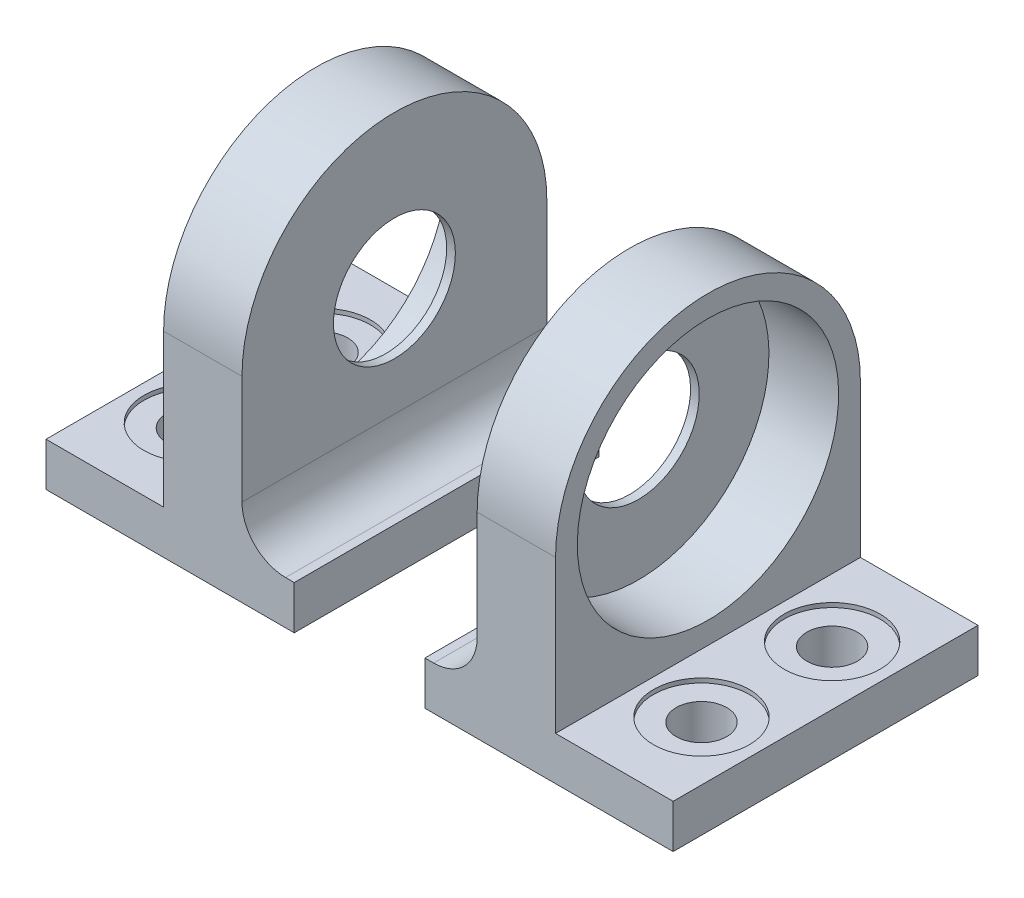
ISO-10303-21;
HEADER;
FILE_DESCRIPTION(('STEP AP214'),'2;1');
FILE_NAME('part.step','',(''),(''),'','','');
FILE_SCHEMA(('AUTOMOTIVE_DESIGN { 1 0 10303 214 1 1 1 1 }'));
ENDSEC;
DATA;
#1=APPLICATION_CONTEXT('core data for automotive mechanical design processes');
#2=APPLICATION_PROTOCOL_DEFINITION('international standard','automotive_design',2000,#1);
#3=PRODUCT_CONTEXT('',#1,'mechanical');
#4=PRODUCT('Part','Part','',(#3));
#5=PRODUCT_RELATED_PRODUCT_CATEGORY('part','',(#4));
#6=PRODUCT_DEFINITION_FORMATION('','',#4);
#7=PRODUCT_DEFINITION_CONTEXT('part definition',#1,'design');
#8=PRODUCT_DEFINITION('design','',#6,#7);
#9=PRODUCT_DEFINITION_SHAPE('','',#8);
#10=(LENGTH_UNIT() NAMED_UNIT(*) SI_UNIT(.MILLI.,.METRE.));
#11=(NAMED_UNIT(*) PLANE_ANGLE_UNIT() SI_UNIT($,.RADIAN.));
#12=(NAMED_UNIT(*) SI_UNIT($,.STERADIAN.) SOLID_ANGLE_UNIT());
#13=UNCERTAINTY_MEASURE_WITH_UNIT(LENGTH_MEASURE(1.E-05),#10,'distance_accuracy_value','');
#14=(GEOMETRIC_REPRESENTATION_CONTEXT(3) GLOBAL_UNCERTAINTY_ASSIGNED_CONTEXT((#13)) GLOBAL_UNIT_ASSIGNED_CONTEXT((#10,
#11,#12)) REPRESENTATION_CONTEXT('',''));
#15=CARTESIAN_POINT('',(0.,0.,0.));
#16=DIRECTION('',(0.,0.,1.));
#17=DIRECTION('',(1.,0.,0.));
#18=AXIS2_PLACEMENT_3D('',#15,#16,#17);
#19=CARTESIAN_POINT('',(36.,5.,35.));
#20=DIRECTION('',(-1.,0.,0.));
#21=DIRECTION('',(0.,-1.,0.));
#22=AXIS2_PLACEMENT_3D('',#19,#20,#21);
#23=PLANE('',#22);
#24=CARTESIAN_POINT('',(36.,22.5,17.5));
#25=DIRECTION('',(1.,0.,0.));
#26=DIRECTION('',(0.,1.,0.));
#27=AXIS2_PLACEMENT_3D('',#24,#25,#26);
#28=CIRCLE('',#27,15.);
#29=CARTESIAN_POINT('',(36.,37.5,17.5));
#30=VERTEX_POINT('',#29);
#31=EDGE_CURVE('E206',#30,#30,#28,.T.);
#32=ORIENTED_EDGE('',*,*,#31,.F.);
#33=EDGE_LOOP('',(#32));
#34=FACE_BOUND('',#33,.T.);
#35=DIRECTION('',(0.,1.,0.));
#36=VECTOR('',#35,1.);
#37=CARTESIAN_POINT('',(36.,5.,0.));
#38=LINE('',#37,#36);
#39=CARTESIAN_POINT('',(36.,5.,0.));
#40=VERTEX_POINT('',#39);
#41=CARTESIAN_POINT('',(36.,22.5,0.));
#42=VERTEX_POINT('',#41);
#43=EDGE_CURVE('E136',#40,#42,#38,.T.);
#44=ORIENTED_EDGE('',*,*,#43,.T.);
#45=CARTESIAN_POINT('',(36.,22.5,17.5));
#46=DIRECTION('',(1.,0.,0.));
#47=DIRECTION('',(0.,1.,0.));
#48=AXIS2_PLACEMENT_3D('',#45,#46,#47);
#49=CIRCLE('',#48,17.5);
#50=CARTESIAN_POINT('',(36.,22.5,35.));
#51=VERTEX_POINT('',#50);
#52=EDGE_CURVE('E124',#42,#51,#49,.T.);
#53=ORIENTED_EDGE('',*,*,#52,.T.);
#54=DIRECTION('',(0.,1.,0.));
#55=VECTOR('',#54,1.);
#56=CARTESIAN_POINT('',(36.,5.,35.));
#57=LINE('',#56,#55);
#58=CARTESIAN_POINT('',(36.,5.,35.));
#59=VERTEX_POINT('',#58);
#60=EDGE_CURVE('E193',#59,#51,#57,.T.);
#61=ORIENTED_EDGE('',*,*,#60,.F.);
#62=DIRECTION('',(0.,0.,-1.));
#63=VECTOR('',#62,1.);
#64=CARTESIAN_POINT('',(36.,5.,35.));
#65=LINE('',#64,#63);
#66=EDGE_CURVE('E147',#59,#40,#65,.T.);
#67=ORIENTED_EDGE('',*,*,#66,.T.);
#68=EDGE_LOOP('',(#44,#53,#61,#67));
#69=FACE_BOUND('',#68,.T.);
#70=ADVANCED_FACE('F48',(#34,#69),#23,.F.);
#71=CARTESIAN_POINT('',(27.,5.,35.));
#72=DIRECTION('',(1.,0.,0.));
#73=DIRECTION('',(0.,1.,0.));
#74=AXIS2_PLACEMENT_3D('',#71,#72,#73);
#75=PLANE('',#74);
#76=CARTESIAN_POINT('',(27.,22.5,17.5));
#77=DIRECTION('',(-1.,0.,0.));
#78=DIRECTION('',(0.,-1.,0.));
#79=AXIS2_PLACEMENT_3D('',#76,#77,#78);
#80=CIRCLE('',#79,7.);
#81=CARTESIAN_POINT('',(27.,15.5,17.5));
#82=VERTEX_POINT('',#81);
#83=EDGE_CURVE('E212',#82,#82,#80,.T.);
#84=ORIENTED_EDGE('',*,*,#83,.F.);
#85=EDGE_LOOP('',(#84));
#86=FACE_BOUND('',#85,.T.);
#87=DIRECTION('',(0.,-1.,0.));
#88=VECTOR('',#87,1.);
#89=CARTESIAN_POINT('',(27.,5.,0.));
#90=LINE('',#89,#88);
#91=CARTESIAN_POINT('',(27.,22.5,0.));
#92=VERTEX_POINT('',#91);
#93=CARTESIAN_POINT('',(27.,9.99999999999999,0.));
#94=VERTEX_POINT('',#93);
#95=EDGE_CURVE('E119',#92,#94,#90,.T.);
#96=ORIENTED_EDGE('',*,*,#95,.T.);
#97=DIRECTION('',(0.,0.,-1.));
#98=VECTOR('',#97,1.);
#99=CARTESIAN_POINT('',(27.,9.99999999999999,35.));
#100=LINE('',#99,#98);
#101=CARTESIAN_POINT('',(27.,9.99999999999999,35.));
#102=VERTEX_POINT('',#101);
#103=EDGE_CURVE('E63',#94,#102,#100,.F.);
#104=ORIENTED_EDGE('',*,*,#103,.T.);
#105=DIRECTION('',(0.,-1.,0.));
#106=VECTOR('',#105,1.);
#107=CARTESIAN_POINT('',(27.,5.,35.));
#108=LINE('',#107,#106);
#109=CARTESIAN_POINT('',(27.,22.5,35.));
#110=VERTEX_POINT('',#109);
#111=EDGE_CURVE('E120',#110,#102,#108,.T.);
#112=ORIENTED_EDGE('',*,*,#111,.F.);
#113=CARTESIAN_POINT('',(27.,22.5,17.5));
#114=DIRECTION('',(1.,0.,0.));
#115=DIRECTION('',(0.,1.,0.));
#116=AXIS2_PLACEMENT_3D('',#113,#114,#115);
#117=CIRCLE('',#116,17.5);
#118=EDGE_CURVE('E116',#92,#110,#117,.T.);
#119=ORIENTED_EDGE('',*,*,#118,.F.);
#120=EDGE_LOOP('',(#96,#104,#112,#119));
#121=FACE_BOUND('',#120,.T.);
#122=ADVANCED_FACE('F118',(#86,#121),#75,.F.);
#123=CARTESIAN_POINT('',(21.,0.,35.));
#124=DIRECTION('',(1.,0.,0.));
#125=DIRECTION('',(0.,0.,-1.));
#126=AXIS2_PLACEMENT_3D('',#123,#124,#125);
#127=PLANE('',#126);
#128=DIRECTION('',(0.,-1.,0.));
#129=VECTOR('',#128,1.);
#130=CARTESIAN_POINT('',(21.,0.,0.));
#131=LINE('',#130,#129);
#132=CARTESIAN_POINT('',(21.,4.99999999999999,0.));
#133=VERTEX_POINT('',#132);
#134=CARTESIAN_POINT('',(21.,0.,0.));
#135=VERTEX_POINT('',#134);
#136=EDGE_CURVE('E172',#133,#135,#131,.T.);
#137=ORIENTED_EDGE('',*,*,#136,.T.);
#138=DIRECTION('',(0.,0.,-1.));
#139=VECTOR('',#138,1.);
#140=CARTESIAN_POINT('',(21.,0.,35.));
#141=LINE('',#140,#139);
#142=CARTESIAN_POINT('',(21.,0.,35.));
#143=VERTEX_POINT('',#142);
#144=EDGE_CURVE('E157',#143,#135,#141,.T.);
#145=ORIENTED_EDGE('',*,*,#144,.F.);
#146=DIRECTION('',(0.,-1.,0.));
#147=VECTOR('',#146,1.);
#148=CARTESIAN_POINT('',(21.,0.,35.));
#149=LINE('',#148,#147);
#150=CARTESIAN_POINT('',(21.,4.99999999999999,35.));
#151=VERTEX_POINT('',#150);
#152=EDGE_CURVE('E138',#151,#143,#149,.T.);
#153=ORIENTED_EDGE('',*,*,#152,.F.);
#154=DIRECTION('',(0.,0.,-1.));
#155=VECTOR('',#154,1.);
#156=CARTESIAN_POINT('',(21.,4.99999999999999,35.));
#157=LINE('',#156,#155);
#158=EDGE_CURVE('E144',#151,#133,#157,.T.);
#159=ORIENTED_EDGE('',*,*,#158,.T.);
#160=EDGE_LOOP('',(#137,#145,#153,#159));
#161=FACE_BOUND('',#160,.T.);
#162=ADVANCED_FACE('F274',(#161),#127,.F.);
#163=CARTESIAN_POINT('',(35.062518270898,0.,35.));
#164=DIRECTION('',(0.,1.,0.));
#165=DIRECTION('',(-1.,0.,0.));
#166=AXIS2_PLACEMENT_3D('',#163,#164,#165);
#167=PLANE('',#166);
#168=CARTESIAN_POINT('',(42.75,0.,10.));
#169=DIRECTION('',(0.,1.,0.));
#170=DIRECTION('',(0.,0.,1.));
#171=AXIS2_PLACEMENT_3D('',#168,#169,#170);
#172=CIRCLE('',#171,2.9);
#173=CARTESIAN_POINT('',(42.75,0.,12.9));
#174=VERTEX_POINT('',#173);
#175=EDGE_CURVE('E229',#174,#174,#172,.T.);
#176=ORIENTED_EDGE('',*,*,#175,.T.);
#177=EDGE_LOOP('',(#176));
#178=FACE_BOUND('',#177,.T.);
#179=CARTESIAN_POINT('',(42.75,0.,25.));
#180=DIRECTION('',(0.,1.,0.));
#181=DIRECTION('',(0.,0.,1.));
#182=AXIS2_PLACEMENT_3D('',#179,#180,#181);
#183=CIRCLE('',#182,2.9);
#184=CARTESIAN_POINT('',(42.75,0.,27.9));
#185=VERTEX_POINT('',#184);
#186=EDGE_CURVE('E215',#185,#185,#183,.T.);
#187=ORIENTED_EDGE('',*,*,#186,.T.);
#188=EDGE_LOOP('',(#187));
#189=FACE_BOUND('',#188,.T.);
#190=DIRECTION('',(1.,0.,0.));
#191=VECTOR('',#190,1.);
#192=CARTESIAN_POINT('',(35.062518270898,0.,0.));
#193=LINE('',#192,#191);
#194=CARTESIAN_POINT('',(49.5,0.,0.));
#195=VERTEX_POINT('',#194);
#196=EDGE_CURVE('E174',#135,#195,#193,.T.);
#197=ORIENTED_EDGE('',*,*,#196,.T.);
#198=DIRECTION('',(0.,0.,-1.));
#199=VECTOR('',#198,1.);
#200=CARTESIAN_POINT('',(49.5,0.,35.));
#201=LINE('',#200,#199);
#202=CARTESIAN_POINT('',(49.5,0.,35.));
#203=VERTEX_POINT('',#202);
#204=EDGE_CURVE('E154',#203,#195,#201,.T.);
#205=ORIENTED_EDGE('',*,*,#204,.F.);
#206=DIRECTION('',(1.,0.,0.));
#207=VECTOR('',#206,1.);
#208=CARTESIAN_POINT('',(27.,0.,35.));
#209=LINE('',#208,#207);
#210=EDGE_CURVE('E201',#143,#203,#209,.T.);
#211=ORIENTED_EDGE('',*,*,#210,.F.);
#212=ORIENTED_EDGE('',*,*,#144,.T.);
#213=EDGE_LOOP('',(#197,#205,#211,#212));
#214=FACE_BOUND('',#213,.T.);
#215=ADVANCED_FACE('F282',(#178,#189,#214),#167,.F.);
#216=CARTESIAN_POINT('',(49.5,0.,35.));
#217=DIRECTION('',(-1.,0.,0.));
#218=DIRECTION('',(0.,0.,1.));
#219=AXIS2_PLACEMENT_3D('',#216,#217,#218);
#220=PLANE('',#219);
#221=DIRECTION('',(0.,1.,0.));
#222=VECTOR('',#221,1.);
#223=CARTESIAN_POINT('',(49.5,0.,0.));
#224=LINE('',#223,#222);
#225=CARTESIAN_POINT('',(49.5,5.00000000000001,0.));
#226=VERTEX_POINT('',#225);
#227=EDGE_CURVE('E178',#195,#226,#224,.T.);
#228=ORIENTED_EDGE('',*,*,#227,.T.);
#229=DIRECTION('',(0.,0.,-1.));
#230=VECTOR('',#229,1.);
#231=CARTESIAN_POINT('',(49.5,5.00000000000001,35.));
#232=LINE('',#231,#230);
#233=CARTESIAN_POINT('',(49.5,5.00000000000001,35.));
#234=VERTEX_POINT('',#233);
#235=EDGE_CURVE('E151',#234,#226,#232,.T.);
#236=ORIENTED_EDGE('',*,*,#235,.F.);
#237=DIRECTION('',(0.,1.,0.));
#238=VECTOR('',#237,1.);
#239=CARTESIAN_POINT('',(49.5,0.,35.));
#240=LINE('',#239,#238);
#241=EDGE_CURVE('E197',#203,#234,#240,.T.);
#242=ORIENTED_EDGE('',*,*,#241,.F.);
#243=ORIENTED_EDGE('',*,*,#204,.T.);
#244=EDGE_LOOP('',(#228,#236,#242,#243));
#245=FACE_BOUND('',#244,.T.);
#246=ADVANCED_FACE('F246',(#245),#220,.F.);
#247=CARTESIAN_POINT('',(36.,5.,35.));
#248=DIRECTION('',(0.,-1.,0.));
#249=DIRECTION('',(1.,0.,0.));
#250=AXIS2_PLACEMENT_3D('',#247,#248,#249);
#251=PLANE('',#250);
#252=CARTESIAN_POINT('',(42.75,5.00000000000001,10.));
#253=DIRECTION('',(0.,1.,0.));
#254=DIRECTION('',(0.,0.,1.));
#255=AXIS2_PLACEMENT_3D('',#252,#253,#254);
#256=CIRCLE('',#255,5.49999999999999);
#257=CARTESIAN_POINT('',(42.75,5.00000000000001,15.5));
#258=VERTEX_POINT('',#257);
#259=EDGE_CURVE('E238',#258,#258,#256,.T.);
#260=ORIENTED_EDGE('',*,*,#259,.F.);
#261=EDGE_LOOP('',(#260));
#262=FACE_BOUND('',#261,.T.);
#263=CARTESIAN_POINT('',(42.75,5.00000000000001,25.));
#264=DIRECTION('',(0.,1.,0.));
#265=DIRECTION('',(0.,0.,1.));
#266=AXIS2_PLACEMENT_3D('',#263,#264,#265);
#267=CIRCLE('',#266,5.49999999999999);
#268=CARTESIAN_POINT('',(42.75,5.00000000000001,30.5));
#269=VERTEX_POINT('',#268);
#270=EDGE_CURVE('E226',#269,#269,#267,.T.);
#271=ORIENTED_EDGE('',*,*,#270,.F.);
#272=EDGE_LOOP('',(#271));
#273=FACE_BOUND('',#272,.T.);
#274=DIRECTION('',(-1.,0.,0.));
#275=VECTOR('',#274,1.);
#276=CARTESIAN_POINT('',(36.,5.,0.));
#277=LINE('',#276,#275);
#278=EDGE_CURVE('E140',#226,#40,#277,.T.);
#279=ORIENTED_EDGE('',*,*,#278,.T.);
#280=ORIENTED_EDGE('',*,*,#66,.F.);
#281=DIRECTION('',(-1.,0.,0.));
#282=VECTOR('',#281,1.);
#283=CARTESIAN_POINT('',(36.,5.,35.));
#284=LINE('',#283,#282);
#285=EDGE_CURVE('E195',#234,#59,#284,.T.);
#286=ORIENTED_EDGE('',*,*,#285,.F.);
#287=ORIENTED_EDGE('',*,*,#235,.T.);
#288=EDGE_LOOP('',(#279,#280,#286,#287));
#289=FACE_BOUND('',#288,.T.);
#290=ADVANCED_FACE('F187',(#262,#273,#289),#251,.F.);
#291=CARTESIAN_POINT('',(27.,5.,35.));
#292=DIRECTION('',(0.,-1.,0.));
#293=DIRECTION('',(1.,0.,0.));
#294=AXIS2_PLACEMENT_3D('',#291,#292,#293);
#295=PLANE('',#294);
#296=DIRECTION('',(-1.,0.,0.));
#297=VECTOR('',#296,1.);
#298=CARTESIAN_POINT('',(27.,5.,35.));
#299=LINE('',#298,#297);
#300=CARTESIAN_POINT('',(22.,4.99999999999999,35.));
#301=VERTEX_POINT('',#300);
#302=EDGE_CURVE('E148',#301,#151,#299,.T.);
#303=ORIENTED_EDGE('',*,*,#302,.F.);
#304=DIRECTION('',(0.,0.,-1.));
#305=VECTOR('',#304,1.);
#306=CARTESIAN_POINT('',(22.,4.99999999999999,0.));
#307=LINE('',#306,#305);
#308=CARTESIAN_POINT('',(22.,4.99999999999999,0.));
#309=VERTEX_POINT('',#308);
#310=EDGE_CURVE('E160',#301,#309,#307,.T.);
#311=ORIENTED_EDGE('',*,*,#310,.T.);
#312=DIRECTION('',(-1.,0.,0.));
#313=VECTOR('',#312,1.);
#314=CARTESIAN_POINT('',(27.,5.,0.));
#315=LINE('',#314,#313);
#316=EDGE_CURVE('E135',#309,#133,#315,.T.);
#317=ORIENTED_EDGE('',*,*,#316,.T.);
#318=ORIENTED_EDGE('',*,*,#158,.F.);
#319=EDGE_LOOP('',(#303,#311,#317,#318));
#320=FACE_BOUND('',#319,.T.);
#321=ADVANCED_FACE('F166',(#320),#295,.F.);
#322=CARTESIAN_POINT('',(0.,0.,35.));
#323=DIRECTION('',(0.,0.,1.));
#324=DIRECTION('',(1.,0.,0.));
#325=AXIS2_PLACEMENT_3D('',#322,#323,#324);
#326=PLANE('',#325);
#327=DIRECTION('',(1.,0.,0.));
#328=VECTOR('',#327,1.);
#329=CARTESIAN_POINT('',(27.,22.5,35.));
#330=LINE('',#329,#328);
#331=EDGE_CURVE('E123',#110,#51,#330,.T.);
#332=ORIENTED_EDGE('',*,*,#331,.F.);
#333=ORIENTED_EDGE('',*,*,#111,.T.);
#334=CARTESIAN_POINT('',(22.,9.99999999999999,35.));
#335=DIRECTION('',(0.,0.,1.));
#336=DIRECTION('',(1.,0.,0.));
#337=AXIS2_PLACEMENT_3D('',#334,#335,#336);
#338=CIRCLE('',#337,5.);
#339=EDGE_CURVE('E12',#102,#301,#338,.F.);
#340=ORIENTED_EDGE('',*,*,#339,.T.);
#341=ORIENTED_EDGE('',*,*,#302,.T.);
#342=ORIENTED_EDGE('',*,*,#152,.T.);
#343=ORIENTED_EDGE('',*,*,#210,.T.);
#344=ORIENTED_EDGE('',*,*,#241,.T.);
#345=ORIENTED_EDGE('',*,*,#285,.T.);
#346=ORIENTED_EDGE('',*,*,#60,.T.);
#347=EDGE_LOOP('',(#332,#333,#340,#341,#342,#343,#344,#345,#346));
#348=FACE_BOUND('',#347,.T.);
#349=ADVANCED_FACE('F318',(#348),#326,.T.);
#350=CARTESIAN_POINT('',(0.,0.,0.));
#351=DIRECTION('',(0.,0.,1.));
#352=DIRECTION('',(1.,0.,0.));
#353=AXIS2_PLACEMENT_3D('',#350,#351,#352);
#354=PLANE('',#353);
#355=ORIENTED_EDGE('',*,*,#95,.F.);
#356=DIRECTION('',(1.,0.,0.));
#357=VECTOR('',#356,1.);
#358=CARTESIAN_POINT('',(27.,22.5,0.));
#359=LINE('',#358,#357);
#360=EDGE_CURVE('E127',#92,#42,#359,.T.);
#361=ORIENTED_EDGE('',*,*,#360,.T.);
#362=ORIENTED_EDGE('',*,*,#43,.F.);
#363=ORIENTED_EDGE('',*,*,#278,.F.);
#364=ORIENTED_EDGE('',*,*,#227,.F.);
#365=ORIENTED_EDGE('',*,*,#196,.F.);
#366=ORIENTED_EDGE('',*,*,#136,.F.);
#367=ORIENTED_EDGE('',*,*,#316,.F.);
#368=CARTESIAN_POINT('',(22.,9.99999999999999,0.));
#369=DIRECTION('',(0.,0.,1.));
#370=DIRECTION('',(1.,0.,0.));
#371=AXIS2_PLACEMENT_3D('',#368,#369,#370);
#372=CIRCLE('',#371,5.);
#373=EDGE_CURVE('E56',#309,#94,#372,.T.);
#374=ORIENTED_EDGE('',*,*,#373,.T.);
#375=EDGE_LOOP('',(#355,#361,#362,#363,#364,#365,#366,#367,#374));
#376=FACE_BOUND('',#375,.T.);
#377=ADVANCED_FACE('F134',(#376),#354,.F.);
#378=CARTESIAN_POINT('',(27.,22.5,17.5));
#379=DIRECTION('',(1.,0.,0.));
#380=DIRECTION('',(0.,1.,0.));
#381=AXIS2_PLACEMENT_3D('',#378,#379,#380);
#382=CYLINDRICAL_SURFACE('',#381,17.5);
#383=ORIENTED_EDGE('',*,*,#52,.F.);
#384=ORIENTED_EDGE('',*,*,#360,.F.);
#385=ORIENTED_EDGE('',*,*,#118,.T.);
#386=ORIENTED_EDGE('',*,*,#331,.T.);
#387=EDGE_LOOP('',(#383,#384,#385,#386));
#388=FACE_BOUND('',#387,.T.);
#389=ADVANCED_FACE('F128',(#388),#382,.T.);
#390=CARTESIAN_POINT('',(28.,22.5,17.5));
#391=DIRECTION('',(1.,0.,0.));
#392=DIRECTION('',(0.,1.,0.));
#393=AXIS2_PLACEMENT_3D('',#390,#391,#392);
#394=CYLINDRICAL_SURFACE('',#393,15.);
#395=CARTESIAN_POINT('',(28.,22.5,17.5));
#396=DIRECTION('',(1.,0.,0.));
#397=DIRECTION('',(0.,1.,0.));
#398=AXIS2_PLACEMENT_3D('',#395,#396,#397);
#399=CIRCLE('',#398,15.);
#400=CARTESIAN_POINT('',(28.,37.5,17.5));
#401=VERTEX_POINT('',#400);
#402=EDGE_CURVE('E132',#401,#401,#399,.T.);
#403=ORIENTED_EDGE('',*,*,#402,.F.);
#404=EDGE_LOOP('',(#403));
#405=FACE_BOUND('',#404,.T.);
#406=ORIENTED_EDGE('',*,*,#31,.T.);
#407=EDGE_LOOP('',(#406));
#408=FACE_BOUND('',#407,.T.);
#409=ADVANCED_FACE('F341',(#405,#408),#394,.F.);
#410=CARTESIAN_POINT('',(28.,22.5,17.5));
#411=DIRECTION('',(1.,0.,0.));
#412=DIRECTION('',(0.,1.,0.));
#413=AXIS2_PLACEMENT_3D('',#410,#411,#412);
#414=PLANE('',#413);
#415=CARTESIAN_POINT('',(28.,22.5,17.5));
#416=DIRECTION('',(-1.,0.,0.));
#417=DIRECTION('',(0.,-1.,0.));
#418=AXIS2_PLACEMENT_3D('',#415,#416,#417);
#419=CIRCLE('',#418,7.);
#420=CARTESIAN_POINT('',(28.,15.5,17.5));
#421=VERTEX_POINT('',#420);
#422=EDGE_CURVE('E209',#421,#421,#419,.T.);
#423=ORIENTED_EDGE('',*,*,#422,.T.);
#424=EDGE_LOOP('',(#423));
#425=FACE_BOUND('',#424,.T.);
#426=ORIENTED_EDGE('',*,*,#402,.T.);
#427=EDGE_LOOP('',(#426));
#428=FACE_BOUND('',#427,.T.);
#429=ADVANCED_FACE('F348',(#425,#428),#414,.T.);
#430=CARTESIAN_POINT('',(28.,22.5,17.5));
#431=DIRECTION('',(-1.,0.,0.));
#432=DIRECTION('',(0.,-1.,0.));
#433=AXIS2_PLACEMENT_3D('',#430,#431,#432);
#434=CYLINDRICAL_SURFACE('',#433,7.);
#435=ORIENTED_EDGE('',*,*,#422,.F.);
#436=EDGE_LOOP('',(#435));
#437=FACE_BOUND('',#436,.T.);
#438=ORIENTED_EDGE('',*,*,#83,.T.);
#439=EDGE_LOOP('',(#438));
#440=FACE_BOUND('',#439,.T.);
#441=ADVANCED_FACE('F356',(#437,#440),#434,.F.);
#442=CARTESIAN_POINT('',(42.75,5.00000000000001,25.));
#443=DIRECTION('',(0.,1.,0.));
#444=DIRECTION('',(0.,0.,1.));
#445=AXIS2_PLACEMENT_3D('',#442,#443,#444);
#446=CYLINDRICAL_SURFACE('',#445,2.9);
#447=ORIENTED_EDGE('',*,*,#186,.F.);
#448=EDGE_LOOP('',(#447));
#449=FACE_BOUND('',#448,.T.);
#450=CARTESIAN_POINT('',(42.75,4.5,25.));
#451=DIRECTION('',(0.,1.,0.));
#452=DIRECTION('',(0.,0.,1.));
#453=AXIS2_PLACEMENT_3D('',#450,#451,#452);
#454=CIRCLE('',#453,2.9);
#455=CARTESIAN_POINT('',(42.75,4.5,27.9));
#456=VERTEX_POINT('',#455);
#457=EDGE_CURVE('E220',#456,#456,#454,.T.);
#458=ORIENTED_EDGE('',*,*,#457,.T.);
#459=EDGE_LOOP('',(#458));
#460=FACE_BOUND('',#459,.T.);
#461=ADVANCED_FACE('F263',(#449,#460),#446,.F.);
#462=CARTESIAN_POINT('',(45.65,4.5,25.));
#463=DIRECTION('',(0.,-1.,0.));
#464=DIRECTION('',(0.,0.,-1.));
#465=AXIS2_PLACEMENT_3D('',#462,#463,#464);
#466=PLANE('',#465);
#467=ORIENTED_EDGE('',*,*,#457,.F.);
#468=EDGE_LOOP('',(#467));
#469=FACE_BOUND('',#468,.T.);
#470=CARTESIAN_POINT('',(42.75,4.5,25.));
#471=DIRECTION('',(0.,1.,0.));
#472=DIRECTION('',(0.,0.,1.));
#473=AXIS2_PLACEMENT_3D('',#470,#471,#472);
#474=CIRCLE('',#473,5.49999999999999);
#475=CARTESIAN_POINT('',(42.75,4.5,30.5));
#476=VERTEX_POINT('',#475);
#477=EDGE_CURVE('E223',#476,#476,#474,.T.);
#478=ORIENTED_EDGE('',*,*,#477,.T.);
#479=EDGE_LOOP('',(#478));
#480=FACE_BOUND('',#479,.T.);
#481=ADVANCED_FACE('F253',(#469,#480),#466,.F.);
#482=CARTESIAN_POINT('',(42.75,5.00000000000001,25.));
#483=DIRECTION('',(0.,1.,0.));
#484=DIRECTION('',(0.,0.,1.));
#485=AXIS2_PLACEMENT_3D('',#482,#483,#484);
#486=CYLINDRICAL_SURFACE('',#485,5.49999999999999);
#487=ORIENTED_EDGE('',*,*,#477,.F.);
#488=EDGE_LOOP('',(#487));
#489=FACE_BOUND('',#488,.T.);
#490=ORIENTED_EDGE('',*,*,#270,.T.);
#491=EDGE_LOOP('',(#490));
#492=FACE_BOUND('',#491,.T.);
#493=ADVANCED_FACE('F250',(#489,#492),#486,.F.);
#494=CARTESIAN_POINT('',(42.75,5.00000000000001,10.));
#495=DIRECTION('',(0.,1.,0.));
#496=DIRECTION('',(0.,0.,1.));
#497=AXIS2_PLACEMENT_3D('',#494,#495,#496);
#498=CYLINDRICAL_SURFACE('',#497,2.9);
#499=ORIENTED_EDGE('',*,*,#175,.F.);
#500=EDGE_LOOP('',(#499));
#501=FACE_BOUND('',#500,.T.);
#502=CARTESIAN_POINT('',(42.75,4.5,10.));
#503=DIRECTION('',(0.,1.,0.));
#504=DIRECTION('',(0.,0.,1.));
#505=AXIS2_PLACEMENT_3D('',#502,#503,#504);
#506=CIRCLE('',#505,2.9);
#507=CARTESIAN_POINT('',(42.75,4.5,12.9));
#508=VERTEX_POINT('',#507);
#509=EDGE_CURVE('E232',#508,#508,#506,.T.);
#510=ORIENTED_EDGE('',*,*,#509,.T.);
#511=EDGE_LOOP('',(#510));
#512=FACE_BOUND('',#511,.T.);
#513=ADVANCED_FACE('F252',(#501,#512),#498,.F.);
#514=CARTESIAN_POINT('',(45.65,4.5,10.));
#515=DIRECTION('',(0.,-1.,0.));
#516=DIRECTION('',(0.,0.,-1.));
#517=AXIS2_PLACEMENT_3D('',#514,#515,#516);
#518=PLANE('',#517);
#519=ORIENTED_EDGE('',*,*,#509,.F.);
#520=EDGE_LOOP('',(#519));
#521=FACE_BOUND('',#520,.T.);
#522=CARTESIAN_POINT('',(42.75,4.5,10.));
#523=DIRECTION('',(0.,1.,0.));
#524=DIRECTION('',(0.,0.,1.));
#525=AXIS2_PLACEMENT_3D('',#522,#523,#524);
#526=CIRCLE('',#525,5.49999999999999);
#527=CARTESIAN_POINT('',(42.75,4.5,15.5));
#528=VERTEX_POINT('',#527);
#529=EDGE_CURVE('E235',#528,#528,#526,.T.);
#530=ORIENTED_EDGE('',*,*,#529,.T.);
#531=EDGE_LOOP('',(#530));
#532=FACE_BOUND('',#531,.T.);
#533=ADVANCED_FACE('F260',(#521,#532),#518,.F.);
#534=CARTESIAN_POINT('',(42.75,5.00000000000001,10.));
#535=DIRECTION('',(0.,1.,0.));
#536=DIRECTION('',(0.,0.,1.));
#537=AXIS2_PLACEMENT_3D('',#534,#535,#536);
#538=CYLINDRICAL_SURFACE('',#537,5.49999999999999);
#539=ORIENTED_EDGE('',*,*,#529,.F.);
#540=EDGE_LOOP('',(#539));
#541=FACE_BOUND('',#540,.T.);
#542=ORIENTED_EDGE('',*,*,#259,.T.);
#543=EDGE_LOOP('',(#542));
#544=FACE_BOUND('',#543,.T.);
#545=ADVANCED_FACE('F242',(#541,#544),#538,.F.);
#546=CARTESIAN_POINT('',(22.,9.99999999999999,35.));
#547=DIRECTION('',(0.,0.,1.));
#548=DIRECTION('',(1.,0.,0.));
#549=AXIS2_PLACEMENT_3D('',#546,#547,#548);
#550=CYLINDRICAL_SURFACE('',#549,5.);
#551=ORIENTED_EDGE('',*,*,#339,.F.);
#552=ORIENTED_EDGE('',*,*,#103,.F.);
#553=ORIENTED_EDGE('',*,*,#373,.F.);
#554=ORIENTED_EDGE('',*,*,#310,.F.);
#555=EDGE_LOOP('',(#551,#552,#553,#554));
#556=FACE_BOUND('',#555,.T.);
#557=ADVANCED_FACE('F50',(#556),#550,.F.);
#558=CLOSED_SHELL('',(#70,#122,#162,#215,#246,#290,#321,#349,#377,#389,#409,#429,#441,#461,#481,
#493,#513,#533,#545,#557));
#559=MANIFOLD_SOLID_BREP('B2',#558);
#560=CARTESIAN_POINT('',(0.,5.,35.));
#561=DIRECTION('',(-1.,0.,0.));
#562=DIRECTION('',(0.,0.,1.));
#563=AXIS2_PLACEMENT_3D('',#560,#561,#562);
#564=PLANE('',#563);
#565=CARTESIAN_POINT('',(0.,22.5,17.5));
#566=DIRECTION('',(1.,0.,0.));
#567=DIRECTION('',(0.,0.,-1.));
#568=AXIS2_PLACEMENT_3D('',#565,#566,#567);
#569=CIRCLE('',#568,7.);
#570=CARTESIAN_POINT('',(0.,22.5,10.5));
#571=VERTEX_POINT('',#570);
#572=EDGE_CURVE('E765',#571,#571,#569,.T.);
#573=ORIENTED_EDGE('',*,*,#572,.F.);
#574=EDGE_LOOP('',(#573));
#575=FACE_BOUND('',#574,.T.);
#576=DIRECTION('',(0.,1.,0.));
#577=VECTOR('',#576,1.);
#578=CARTESIAN_POINT('',(0.,5.,35.));
#579=LINE('',#578,#577);
#580=CARTESIAN_POINT('',(0.,10.,35.));
#581=VERTEX_POINT('',#580);
#582=CARTESIAN_POINT('',(0.,22.5,35.));
#583=VERTEX_POINT('',#582);
#584=EDGE_CURVE('E535',#581,#583,#579,.T.);
#585=ORIENTED_EDGE('',*,*,#584,.F.);
#586=DIRECTION('',(0.,0.,-1.));
#587=VECTOR('',#586,1.);
#588=CARTESIAN_POINT('',(0.,10.,0.));
#589=LINE('',#588,#587);
#590=CARTESIAN_POINT('',(0.,10.,0.));
#591=VERTEX_POINT('',#590);
#592=EDGE_CURVE('E632',#581,#591,#589,.T.);
#593=ORIENTED_EDGE('',*,*,#592,.T.);
#594=DIRECTION('',(0.,1.,0.));
#595=VECTOR('',#594,1.);
#596=CARTESIAN_POINT('',(0.,5.,0.));
#597=LINE('',#596,#595);
#598=CARTESIAN_POINT('',(0.,22.5,0.));
#599=VERTEX_POINT('',#598);
#600=EDGE_CURVE('E551',#591,#599,#597,.T.);
#601=ORIENTED_EDGE('',*,*,#600,.T.);
#602=CARTESIAN_POINT('',(0.,22.5,17.5));
#603=DIRECTION('',(-1.,0.,0.));
#604=DIRECTION('',(0.,0.,1.));
#605=AXIS2_PLACEMENT_3D('',#602,#603,#604);
#606=CIRCLE('',#605,17.5);
#607=EDGE_CURVE('E550',#583,#599,#606,.T.);
#608=ORIENTED_EDGE('',*,*,#607,.F.);
#609=EDGE_LOOP('',(#585,#593,#601,#608));
#610=FACE_BOUND('',#609,.T.);
#611=ADVANCED_FACE('F463',(#575,#610),#564,.F.);
#612=CARTESIAN_POINT('',(-9.,5.,35.));
#613=DIRECTION('',(1.,0.,0.));
#614=DIRECTION('',(0.,0.,-1.));
#615=AXIS2_PLACEMENT_3D('',#612,#613,#614);
#616=PLANE('',#615);
#617=CARTESIAN_POINT('',(-9.,22.5,17.5));
#618=DIRECTION('',(-1.,0.,0.));
#619=DIRECTION('',(0.,0.,1.));
#620=AXIS2_PLACEMENT_3D('',#617,#618,#619);
#621=CIRCLE('',#620,15.);
#622=CARTESIAN_POINT('',(-9.,22.5,32.5));
#623=VERTEX_POINT('',#622);
#624=EDGE_CURVE('E567',#623,#623,#621,.T.);
#625=ORIENTED_EDGE('',*,*,#624,.F.);
#626=EDGE_LOOP('',(#625));
#627=FACE_BOUND('',#626,.T.);
#628=DIRECTION('',(0.,-1.,0.));
#629=VECTOR('',#628,1.);
#630=CARTESIAN_POINT('',(-9.,5.,35.));
#631=LINE('',#630,#629);
#632=CARTESIAN_POINT('',(-9.,22.5,35.));
#633=VERTEX_POINT('',#632);
#634=CARTESIAN_POINT('',(-9.,5.,35.));
#635=VERTEX_POINT('',#634);
#636=EDGE_CURVE('E546',#633,#635,#631,.T.);
#637=ORIENTED_EDGE('',*,*,#636,.F.);
#638=CARTESIAN_POINT('',(-9.,22.5,17.5));
#639=DIRECTION('',(-1.,0.,0.));
#640=DIRECTION('',(0.,0.,1.));
#641=AXIS2_PLACEMENT_3D('',#638,#639,#640);
#642=CIRCLE('',#641,17.5);
#643=CARTESIAN_POINT('',(-9.,22.5,0.));
#644=VERTEX_POINT('',#643);
#645=EDGE_CURVE('E556',#633,#644,#642,.T.);
#646=ORIENTED_EDGE('',*,*,#645,.T.);
#647=DIRECTION('',(0.,-1.,0.));
#648=VECTOR('',#647,1.);
#649=CARTESIAN_POINT('',(-9.,5.,0.));
#650=LINE('',#649,#648);
#651=CARTESIAN_POINT('',(-9.,5.,0.));
#652=VERTEX_POINT('',#651);
#653=EDGE_CURVE('E601',#644,#652,#650,.T.);
#654=ORIENTED_EDGE('',*,*,#653,.T.);
#655=DIRECTION('',(0.,0.,-1.));
#656=VECTOR('',#655,1.);
#657=CARTESIAN_POINT('',(-9.,5.,35.));
#658=LINE('',#657,#656);
#659=EDGE_CURVE('E620',#635,#652,#658,.T.);
#660=ORIENTED_EDGE('',*,*,#659,.F.);
#661=EDGE_LOOP('',(#637,#646,#654,#660));
#662=FACE_BOUND('',#661,.T.);
#663=ADVANCED_FACE('F642',(#627,#662),#616,.F.);
#664=CARTESIAN_POINT('',(0.,0.,35.));
#665=DIRECTION('',(0.,0.,1.));
#666=DIRECTION('',(1.,0.,0.));
#667=AXIS2_PLACEMENT_3D('',#664,#665,#666);
#668=PLANE('',#667);
#669=DIRECTION('',(-1.,0.,0.));
#670=VECTOR('',#669,1.);
#671=CARTESIAN_POINT('',(0.,5.,35.));
#672=LINE('',#671,#670);
#673=CARTESIAN_POINT('',(6.,5.,35.));
#674=VERTEX_POINT('',#673);
#675=CARTESIAN_POINT('',(5.,5.,35.));
#676=VERTEX_POINT('',#675);
#677=EDGE_CURVE('E547',#674,#676,#672,.T.);
#678=ORIENTED_EDGE('',*,*,#677,.T.);
#679=CARTESIAN_POINT('',(5.,10.,35.));
#680=DIRECTION('',(0.,0.,1.));
#681=DIRECTION('',(1.,0.,0.));
#682=AXIS2_PLACEMENT_3D('',#679,#680,#681);
#683=CIRCLE('',#682,5.);
#684=EDGE_CURVE('E46',#676,#581,#683,.F.);
#685=ORIENTED_EDGE('',*,*,#684,.T.);
#686=ORIENTED_EDGE('',*,*,#584,.T.);
#687=DIRECTION('',(-1.,0.,0.));
#688=VECTOR('',#687,1.);
#689=CARTESIAN_POINT('',(0.,22.5,35.));
#690=LINE('',#689,#688);
#691=EDGE_CURVE('E539',#583,#633,#690,.T.);
#692=ORIENTED_EDGE('',*,*,#691,.T.);
#693=ORIENTED_EDGE('',*,*,#636,.T.);
#694=DIRECTION('',(-1.,0.,0.));
#695=VECTOR('',#694,1.);
#696=CARTESIAN_POINT('',(-9.,5.,35.));
#697=LINE('',#696,#695);
#698=CARTESIAN_POINT('',(-22.5,5.,35.));
#699=VERTEX_POINT('',#698);
#700=EDGE_CURVE('E586',#635,#699,#697,.T.);
#701=ORIENTED_EDGE('',*,*,#700,.T.);
#702=DIRECTION('',(0.,-1.,0.));
#703=VECTOR('',#702,1.);
#704=CARTESIAN_POINT('',(-22.5,0.,35.));
#705=LINE('',#704,#703);
#706=CARTESIAN_POINT('',(-22.5,0.,35.));
#707=VERTEX_POINT('',#706);
#708=EDGE_CURVE('E589',#699,#707,#705,.T.);
#709=ORIENTED_EDGE('',*,*,#708,.T.);
#710=DIRECTION('',(1.,0.,0.));
#711=VECTOR('',#710,1.);
#712=CARTESIAN_POINT('',(0.,0.,35.));
#713=LINE('',#712,#711);
#714=CARTESIAN_POINT('',(6.,0.,35.));
#715=VERTEX_POINT('',#714);
#716=EDGE_CURVE('E574',#707,#715,#713,.T.);
#717=ORIENTED_EDGE('',*,*,#716,.T.);
#718=DIRECTION('',(0.,1.,0.));
#719=VECTOR('',#718,1.);
#720=CARTESIAN_POINT('',(6.,0.,35.));
#721=LINE('',#720,#719);
#722=EDGE_CURVE('E578',#715,#674,#721,.T.);
#723=ORIENTED_EDGE('',*,*,#722,.T.);
#724=EDGE_LOOP('',(#678,#685,#686,#692,#693,#701,#709,#717,#723));
#725=FACE_BOUND('',#724,.T.);
#726=ADVANCED_FACE('F537',(#725),#668,.T.);
#727=CARTESIAN_POINT('',(0.,0.,0.));
#728=DIRECTION('',(0.,0.,1.));
#729=DIRECTION('',(1.,0.,0.));
#730=AXIS2_PLACEMENT_3D('',#727,#728,#729);
#731=PLANE('',#730);
#732=DIRECTION('',(-1.,0.,0.));
#733=VECTOR('',#732,1.);
#734=CARTESIAN_POINT('',(0.,22.5,0.));
#735=LINE('',#734,#733);
#736=EDGE_CURVE('E555',#599,#644,#735,.T.);
#737=ORIENTED_EDGE('',*,*,#736,.F.);
#738=ORIENTED_EDGE('',*,*,#600,.F.);
#739=CARTESIAN_POINT('',(5.,10.,0.));
#740=DIRECTION('',(0.,0.,1.));
#741=DIRECTION('',(1.,0.,0.));
#742=AXIS2_PLACEMENT_3D('',#739,#740,#741);
#743=CIRCLE('',#742,5.);
#744=CARTESIAN_POINT('',(5.,5.,0.));
#745=VERTEX_POINT('',#744);
#746=EDGE_CURVE('E472',#591,#745,#743,.T.);
#747=ORIENTED_EDGE('',*,*,#746,.T.);
#748=DIRECTION('',(-1.,0.,0.));
#749=VECTOR('',#748,1.);
#750=CARTESIAN_POINT('',(0.,5.,0.));
#751=LINE('',#750,#749);
#752=CARTESIAN_POINT('',(6.,5.,0.));
#753=VERTEX_POINT('',#752);
#754=EDGE_CURVE('E596',#753,#745,#751,.T.);
#755=ORIENTED_EDGE('',*,*,#754,.F.);
#756=DIRECTION('',(0.,1.,0.));
#757=VECTOR('',#756,1.);
#758=CARTESIAN_POINT('',(6.,0.,0.));
#759=LINE('',#758,#757);
#760=CARTESIAN_POINT('',(6.,0.,0.));
#761=VERTEX_POINT('',#760);
#762=EDGE_CURVE('E573',#761,#753,#759,.T.);
#763=ORIENTED_EDGE('',*,*,#762,.F.);
#764=DIRECTION('',(1.,0.,0.));
#765=VECTOR('',#764,1.);
#766=CARTESIAN_POINT('',(0.,0.,0.));
#767=LINE('',#766,#765);
#768=CARTESIAN_POINT('',(-22.5,0.,0.));
#769=VERTEX_POINT('',#768);
#770=EDGE_CURVE('E579',#769,#761,#767,.T.);
#771=ORIENTED_EDGE('',*,*,#770,.F.);
#772=DIRECTION('',(0.,-1.,0.));
#773=VECTOR('',#772,1.);
#774=CARTESIAN_POINT('',(-22.5,0.,0.));
#775=LINE('',#774,#773);
#776=CARTESIAN_POINT('',(-22.5,5.,0.));
#777=VERTEX_POINT('',#776);
#778=EDGE_CURVE('E607',#777,#769,#775,.T.);
#779=ORIENTED_EDGE('',*,*,#778,.F.);
#780=DIRECTION('',(-1.,0.,0.));
#781=VECTOR('',#780,1.);
#782=CARTESIAN_POINT('',(-9.,5.,0.));
#783=LINE('',#782,#781);
#784=EDGE_CURVE('E604',#652,#777,#783,.T.);
#785=ORIENTED_EDGE('',*,*,#784,.F.);
#786=ORIENTED_EDGE('',*,*,#653,.F.);
#787=EDGE_LOOP('',(#737,#738,#747,#755,#763,#771,#779,#785,#786));
#788=FACE_BOUND('',#787,.T.);
#789=ADVANCED_FACE('F638',(#788),#731,.F.);
#790=CARTESIAN_POINT('',(6.,0.,35.));
#791=DIRECTION('',(-1.,0.,0.));
#792=DIRECTION('',(0.,0.,1.));
#793=AXIS2_PLACEMENT_3D('',#790,#791,#792);
#794=PLANE('',#793);
#795=ORIENTED_EDGE('',*,*,#762,.T.);
#796=DIRECTION('',(0.,0.,-1.));
#797=VECTOR('',#796,1.);
#798=CARTESIAN_POINT('',(6.,5.,35.));
#799=LINE('',#798,#797);
#800=EDGE_CURVE('E624',#674,#753,#799,.T.);
#801=ORIENTED_EDGE('',*,*,#800,.F.);
#802=ORIENTED_EDGE('',*,*,#722,.F.);
#803=DIRECTION('',(0.,0.,-1.));
#804=VECTOR('',#803,1.);
#805=CARTESIAN_POINT('',(6.,0.,35.));
#806=LINE('',#805,#804);
#807=EDGE_CURVE('E628',#715,#761,#806,.T.);
#808=ORIENTED_EDGE('',*,*,#807,.T.);
#809=EDGE_LOOP('',(#795,#801,#802,#808));
#810=FACE_BOUND('',#809,.T.);
#811=ADVANCED_FACE('F659',(#810),#794,.F.);
#812=CARTESIAN_POINT('',(0.,5.,35.));
#813=DIRECTION('',(0.,-1.,0.));
#814=DIRECTION('',(0.,0.,-1.));
#815=AXIS2_PLACEMENT_3D('',#812,#813,#814);
#816=PLANE('',#815);
#817=ORIENTED_EDGE('',*,*,#754,.T.);
#818=DIRECTION('',(0.,0.,-1.));
#819=VECTOR('',#818,1.);
#820=CARTESIAN_POINT('',(5.,5.,35.));
#821=LINE('',#820,#819);
#822=EDGE_CURVE('E479',#745,#676,#821,.F.);
#823=ORIENTED_EDGE('',*,*,#822,.T.);
#824=ORIENTED_EDGE('',*,*,#677,.F.);
#825=ORIENTED_EDGE('',*,*,#800,.T.);
#826=EDGE_LOOP('',(#817,#823,#824,#825));
#827=FACE_BOUND('',#826,.T.);
#828=ADVANCED_FACE('F660',(#827),#816,.F.);
#829=CARTESIAN_POINT('',(-9.,5.,35.));
#830=DIRECTION('',(0.,-1.,0.));
#831=DIRECTION('',(1.,0.,0.));
#832=AXIS2_PLACEMENT_3D('',#829,#830,#831);
#833=PLANE('',#832);
#834=CARTESIAN_POINT('',(-15.75,5.,10.));
#835=DIRECTION('',(0.,1.,0.));
#836=DIRECTION('',(0.,0.,1.));
#837=AXIS2_PLACEMENT_3D('',#834,#835,#836);
#838=CIRCLE('',#837,5.49999999999999);
#839=CARTESIAN_POINT('',(-15.75,5.,15.5));
#840=VERTEX_POINT('',#839);
#841=EDGE_CURVE('E735',#840,#840,#838,.T.);
#842=ORIENTED_EDGE('',*,*,#841,.F.);
#843=EDGE_LOOP('',(#842));
#844=FACE_BOUND('',#843,.T.);
#845=CARTESIAN_POINT('',(-15.75,5.,25.));
#846=DIRECTION('',(0.,1.,0.));
#847=DIRECTION('',(0.,0.,1.));
#848=AXIS2_PLACEMENT_3D('',#845,#846,#847);
#849=CIRCLE('',#848,5.49999999999999);
#850=CARTESIAN_POINT('',(-15.75,5.,30.5));
#851=VERTEX_POINT('',#850);
#852=EDGE_CURVE('E749',#851,#851,#849,.T.);
#853=ORIENTED_EDGE('',*,*,#852,.F.);
#854=EDGE_LOOP('',(#853));
#855=FACE_BOUND('',#854,.T.);
#856=ORIENTED_EDGE('',*,*,#784,.T.);
#857=DIRECTION('',(0.,0.,-1.));
#858=VECTOR('',#857,1.);
#859=CARTESIAN_POINT('',(-22.5,5.,35.));
#860=LINE('',#859,#858);
#861=EDGE_CURVE('E616',#699,#777,#860,.T.);
#862=ORIENTED_EDGE('',*,*,#861,.F.);
#863=ORIENTED_EDGE('',*,*,#700,.F.);
#864=ORIENTED_EDGE('',*,*,#659,.T.);
#865=EDGE_LOOP('',(#856,#862,#863,#864));
#866=FACE_BOUND('',#865,.T.);
#867=ADVANCED_FACE('F649',(#844,#855,#866),#833,.F.);
#868=CARTESIAN_POINT('',(-22.5,0.,35.));
#869=DIRECTION('',(1.,0.,0.));
#870=DIRECTION('',(0.,0.,-1.));
#871=AXIS2_PLACEMENT_3D('',#868,#869,#870);
#872=PLANE('',#871);
#873=ORIENTED_EDGE('',*,*,#778,.T.);
#874=DIRECTION('',(0.,0.,-1.));
#875=VECTOR('',#874,1.);
#876=CARTESIAN_POINT('',(-22.5,0.,35.));
#877=LINE('',#876,#875);
#878=EDGE_CURVE('E593',#707,#769,#877,.T.);
#879=ORIENTED_EDGE('',*,*,#878,.F.);
#880=ORIENTED_EDGE('',*,*,#708,.F.);
#881=ORIENTED_EDGE('',*,*,#861,.T.);
#882=EDGE_LOOP('',(#873,#879,#880,#881));
#883=FACE_BOUND('',#882,.T.);
#884=ADVANCED_FACE('F652',(#883),#872,.F.);
#885=CARTESIAN_POINT('',(0.,0.,35.));
#886=DIRECTION('',(0.,1.,0.));
#887=DIRECTION('',(0.,0.,1.));
#888=AXIS2_PLACEMENT_3D('',#885,#886,#887);
#889=PLANE('',#888);
#890=CARTESIAN_POINT('',(-15.75,0.,10.));
#891=DIRECTION('',(0.,1.,0.));
#892=DIRECTION('',(0.,0.,1.));
#893=AXIS2_PLACEMENT_3D('',#890,#891,#892);
#894=CIRCLE('',#893,2.9);
#895=CARTESIAN_POINT('',(-15.75,0.,12.9));
#896=VERTEX_POINT('',#895);
#897=EDGE_CURVE('E745',#896,#896,#894,.T.);
#898=ORIENTED_EDGE('',*,*,#897,.T.);
#899=EDGE_LOOP('',(#898));
#900=FACE_BOUND('',#899,.T.);
#901=CARTESIAN_POINT('',(-15.75,0.,25.));
#902=DIRECTION('',(0.,1.,0.));
#903=DIRECTION('',(0.,0.,1.));
#904=AXIS2_PLACEMENT_3D('',#901,#902,#903);
#905=CIRCLE('',#904,2.9);
#906=CARTESIAN_POINT('',(-15.75,0.,27.9));
#907=VERTEX_POINT('',#906);
#908=EDGE_CURVE('E761',#907,#907,#905,.T.);
#909=ORIENTED_EDGE('',*,*,#908,.T.);
#910=EDGE_LOOP('',(#909));
#911=FACE_BOUND('',#910,.T.);
#912=ORIENTED_EDGE('',*,*,#770,.T.);
#913=ORIENTED_EDGE('',*,*,#807,.F.);
#914=ORIENTED_EDGE('',*,*,#716,.F.);
#915=ORIENTED_EDGE('',*,*,#878,.T.);
#916=EDGE_LOOP('',(#912,#913,#914,#915));
#917=FACE_BOUND('',#916,.T.);
#918=ADVANCED_FACE('F654',(#900,#911,#917),#889,.F.);
#919=CARTESIAN_POINT('',(0.,22.5,17.5));
#920=DIRECTION('',(-1.,0.,0.));
#921=DIRECTION('',(0.,0.,1.));
#922=AXIS2_PLACEMENT_3D('',#919,#920,#921);
#923=CYLINDRICAL_SURFACE('',#922,17.5);
#924=ORIENTED_EDGE('',*,*,#645,.F.);
#925=ORIENTED_EDGE('',*,*,#691,.F.);
#926=ORIENTED_EDGE('',*,*,#607,.T.);
#927=ORIENTED_EDGE('',*,*,#736,.T.);
#928=EDGE_LOOP('',(#924,#925,#926,#927));
#929=FACE_BOUND('',#928,.T.);
#930=ADVANCED_FACE('F558',(#929),#923,.T.);
#931=CARTESIAN_POINT('',(-0.999999999999999,22.5,17.5));
#932=DIRECTION('',(-1.,0.,0.));
#933=DIRECTION('',(0.,0.,1.));
#934=AXIS2_PLACEMENT_3D('',#931,#932,#933);
#935=CYLINDRICAL_SURFACE('',#934,15.);
#936=CARTESIAN_POINT('',(-0.999999999999999,22.5,17.5));
#937=DIRECTION('',(-1.,0.,0.));
#938=DIRECTION('',(0.,0.,1.));
#939=AXIS2_PLACEMENT_3D('',#936,#937,#938);
#940=CIRCLE('',#939,15.);
#941=CARTESIAN_POINT('',(-0.999999999999999,22.5,32.5));
#942=VERTEX_POINT('',#941);
#943=EDGE_CURVE('E561',#942,#942,#940,.T.);
#944=ORIENTED_EDGE('',*,*,#943,.F.);
#945=EDGE_LOOP('',(#944));
#946=FACE_BOUND('',#945,.T.);
#947=ORIENTED_EDGE('',*,*,#624,.T.);
#948=EDGE_LOOP('',(#947));
#949=FACE_BOUND('',#948,.T.);
#950=ADVANCED_FACE('F692',(#946,#949),#935,.F.);
#951=CARTESIAN_POINT('',(-0.999999999999999,22.5,17.5));
#952=DIRECTION('',(-1.,0.,0.));
#953=DIRECTION('',(0.,0.,1.));
#954=AXIS2_PLACEMENT_3D('',#951,#952,#953);
#955=PLANE('',#954);
#956=CARTESIAN_POINT('',(-1.,22.5,17.5));
#957=DIRECTION('',(1.,0.,0.));
#958=DIRECTION('',(0.,0.,-1.));
#959=AXIS2_PLACEMENT_3D('',#956,#957,#958);
#960=CIRCLE('',#959,7.);
#961=CARTESIAN_POINT('',(-1.,22.5,10.5));
#962=VERTEX_POINT('',#961);
#963=EDGE_CURVE('E766',#962,#962,#960,.T.);
#964=ORIENTED_EDGE('',*,*,#963,.T.);
#965=EDGE_LOOP('',(#964));
#966=FACE_BOUND('',#965,.T.);
#967=ORIENTED_EDGE('',*,*,#943,.T.);
#968=EDGE_LOOP('',(#967));
#969=FACE_BOUND('',#968,.T.);
#970=ADVANCED_FACE('F695',(#966,#969),#955,.T.);
#971=CARTESIAN_POINT('',(-1.,22.5,17.5));
#972=DIRECTION('',(1.,0.,0.));
#973=DIRECTION('',(0.,0.,-1.));
#974=AXIS2_PLACEMENT_3D('',#971,#972,#973);
#975=CYLINDRICAL_SURFACE('',#974,7.);
#976=ORIENTED_EDGE('',*,*,#963,.F.);
#977=EDGE_LOOP('',(#976));
#978=FACE_BOUND('',#977,.T.);
#979=ORIENTED_EDGE('',*,*,#572,.T.);
#980=EDGE_LOOP('',(#979));
#981=FACE_BOUND('',#980,.T.);
#982=ADVANCED_FACE('F699',(#978,#981),#975,.F.);
#983=CARTESIAN_POINT('',(-15.75,5.,25.));
#984=DIRECTION('',(0.,1.,0.));
#985=DIRECTION('',(0.,0.,1.));
#986=AXIS2_PLACEMENT_3D('',#983,#984,#985);
#987=CYLINDRICAL_SURFACE('',#986,2.9);
#988=ORIENTED_EDGE('',*,*,#908,.F.);
#989=EDGE_LOOP('',(#988));
#990=FACE_BOUND('',#989,.T.);
#991=CARTESIAN_POINT('',(-15.75,4.5,25.));
#992=DIRECTION('',(0.,1.,0.));
#993=DIRECTION('',(0.,0.,1.));
#994=AXIS2_PLACEMENT_3D('',#991,#992,#993);
#995=CIRCLE('',#994,2.9);
#996=CARTESIAN_POINT('',(-15.75,4.5,27.9));
#997=VERTEX_POINT('',#996);
#998=EDGE_CURVE('E757',#997,#997,#995,.T.);
#999=ORIENTED_EDGE('',*,*,#998,.T.);
#1000=EDGE_LOOP('',(#999));
#1001=FACE_BOUND('',#1000,.T.);
#1002=ADVANCED_FACE('F703',(#990,#1001),#987,.F.);
#1003=CARTESIAN_POINT('',(-12.85,4.5,25.));
#1004=DIRECTION('',(0.,-1.,0.));
#1005=DIRECTION('',(0.,0.,-1.));
#1006=AXIS2_PLACEMENT_3D('',#1003,#1004,#1005);
#1007=PLANE('',#1006);
#1008=ORIENTED_EDGE('',*,*,#998,.F.);
#1009=EDGE_LOOP('',(#1008));
#1010=FACE_BOUND('',#1009,.T.);
#1011=CARTESIAN_POINT('',(-15.75,4.5,25.));
#1012=DIRECTION('',(0.,1.,0.));
#1013=DIRECTION('',(0.,0.,1.));
#1014=AXIS2_PLACEMENT_3D('',#1011,#1012,#1013);
#1015=CIRCLE('',#1014,5.49999999999999);
#1016=CARTESIAN_POINT('',(-15.75,4.5,30.5));
#1017=VERTEX_POINT('',#1016);
#1018=EDGE_CURVE('E753',#1017,#1017,#1015,.T.);
#1019=ORIENTED_EDGE('',*,*,#1018,.T.);
#1020=EDGE_LOOP('',(#1019));
#1021=FACE_BOUND('',#1020,.T.);
#1022=ADVANCED_FACE('F707',(#1010,#1021),#1007,.F.);
#1023=CARTESIAN_POINT('',(-15.75,5.,25.));
#1024=DIRECTION('',(0.,1.,0.));
#1025=DIRECTION('',(0.,0.,1.));
#1026=AXIS2_PLACEMENT_3D('',#1023,#1024,#1025);
#1027=CYLINDRICAL_SURFACE('',#1026,5.49999999999999);
#1028=ORIENTED_EDGE('',*,*,#1018,.F.);
#1029=EDGE_LOOP('',(#1028));
#1030=FACE_BOUND('',#1029,.T.);
#1031=ORIENTED_EDGE('',*,*,#852,.T.);
#1032=EDGE_LOOP('',(#1031));
#1033=FACE_BOUND('',#1032,.T.);
#1034=ADVANCED_FACE('F711',(#1030,#1033),#1027,.F.);
#1035=CARTESIAN_POINT('',(-15.75,5.,10.));
#1036=DIRECTION('',(0.,1.,0.));
#1037=DIRECTION('',(0.,0.,1.));
#1038=AXIS2_PLACEMENT_3D('',#1035,#1036,#1037);
#1039=CYLINDRICAL_SURFACE('',#1038,2.9);
#1040=ORIENTED_EDGE('',*,*,#897,.F.);
#1041=EDGE_LOOP('',(#1040));
#1042=FACE_BOUND('',#1041,.T.);
#1043=CARTESIAN_POINT('',(-15.75,4.5,10.));
#1044=DIRECTION('',(0.,1.,0.));
#1045=DIRECTION('',(0.,0.,1.));
#1046=AXIS2_PLACEMENT_3D('',#1043,#1044,#1045);
#1047=CIRCLE('',#1046,2.9);
#1048=CARTESIAN_POINT('',(-15.75,4.5,12.9));
#1049=VERTEX_POINT('',#1048);
#1050=EDGE_CURVE('E739',#1049,#1049,#1047,.T.);
#1051=ORIENTED_EDGE('',*,*,#1050,.T.);
#1052=EDGE_LOOP('',(#1051));
#1053=FACE_BOUND('',#1052,.T.);
#1054=ADVANCED_FACE('F715',(#1042,#1053),#1039,.F.);
#1055=CARTESIAN_POINT('',(-12.85,4.5,10.));
#1056=DIRECTION('',(0.,-1.,0.));
#1057=DIRECTION('',(0.,0.,-1.));
#1058=AXIS2_PLACEMENT_3D('',#1055,#1056,#1057);
#1059=PLANE('',#1058);
#1060=ORIENTED_EDGE('',*,*,#1050,.F.);
#1061=EDGE_LOOP('',(#1060));
#1062=FACE_BOUND('',#1061,.T.);
#1063=CARTESIAN_POINT('',(-15.75,4.5,10.));
#1064=DIRECTION('',(0.,1.,0.));
#1065=DIRECTION('',(0.,0.,1.));
#1066=AXIS2_PLACEMENT_3D('',#1063,#1064,#1065);
#1067=CIRCLE('',#1066,5.49999999999999);
#1068=CARTESIAN_POINT('',(-15.75,4.5,15.5));
#1069=VERTEX_POINT('',#1068);
#1070=EDGE_CURVE('E732',#1069,#1069,#1067,.T.);
#1071=ORIENTED_EDGE('',*,*,#1070,.T.);
#1072=EDGE_LOOP('',(#1071));
#1073=FACE_BOUND('',#1072,.T.);
#1074=ADVANCED_FACE('F719',(#1062,#1073),#1059,.F.);
#1075=CARTESIAN_POINT('',(-15.75,5.,10.));
#1076=DIRECTION('',(0.,1.,0.));
#1077=DIRECTION('',(0.,0.,1.));
#1078=AXIS2_PLACEMENT_3D('',#1075,#1076,#1077);
#1079=CYLINDRICAL_SURFACE('',#1078,5.49999999999999);
#1080=ORIENTED_EDGE('',*,*,#1070,.F.);
#1081=EDGE_LOOP('',(#1080));
#1082=FACE_BOUND('',#1081,.T.);
#1083=ORIENTED_EDGE('',*,*,#841,.T.);
#1084=EDGE_LOOP('',(#1083));
#1085=FACE_BOUND('',#1084,.T.);
#1086=ADVANCED_FACE('F723',(#1082,#1085),#1079,.F.);
#1087=CARTESIAN_POINT('',(5.,10.,35.));
#1088=DIRECTION('',(0.,0.,1.));
#1089=DIRECTION('',(1.,0.,0.));
#1090=AXIS2_PLACEMENT_3D('',#1087,#1088,#1089);
#1091=CYLINDRICAL_SURFACE('',#1090,5.);
#1092=ORIENTED_EDGE('',*,*,#684,.F.);
#1093=ORIENTED_EDGE('',*,*,#822,.F.);
#1094=ORIENTED_EDGE('',*,*,#746,.F.);
#1095=ORIENTED_EDGE('',*,*,#592,.F.);
#1096=EDGE_LOOP('',(#1092,#1093,#1094,#1095));
#1097=FACE_BOUND('',#1096,.T.);
#1098=ADVANCED_FACE('F465',(#1097),#1091,.F.);
#1099=CLOSED_SHELL('',(#611,#663,#726,#789,#811,#828,#867,#884,#918,#930,#950,#970,#982,#1002,
#1022,#1034,#1054,#1074,#1086,#1098));
#1100=MANIFOLD_SOLID_BREP('B6',#1099);
#1101=ADVANCED_BREP_SHAPE_REPRESENTATION('',(#18,#559,#1100),#14);
#1102=SHAPE_DEFINITION_REPRESENTATION(#9,#1101);
ENDSEC;
END-ISO-10303-21;
